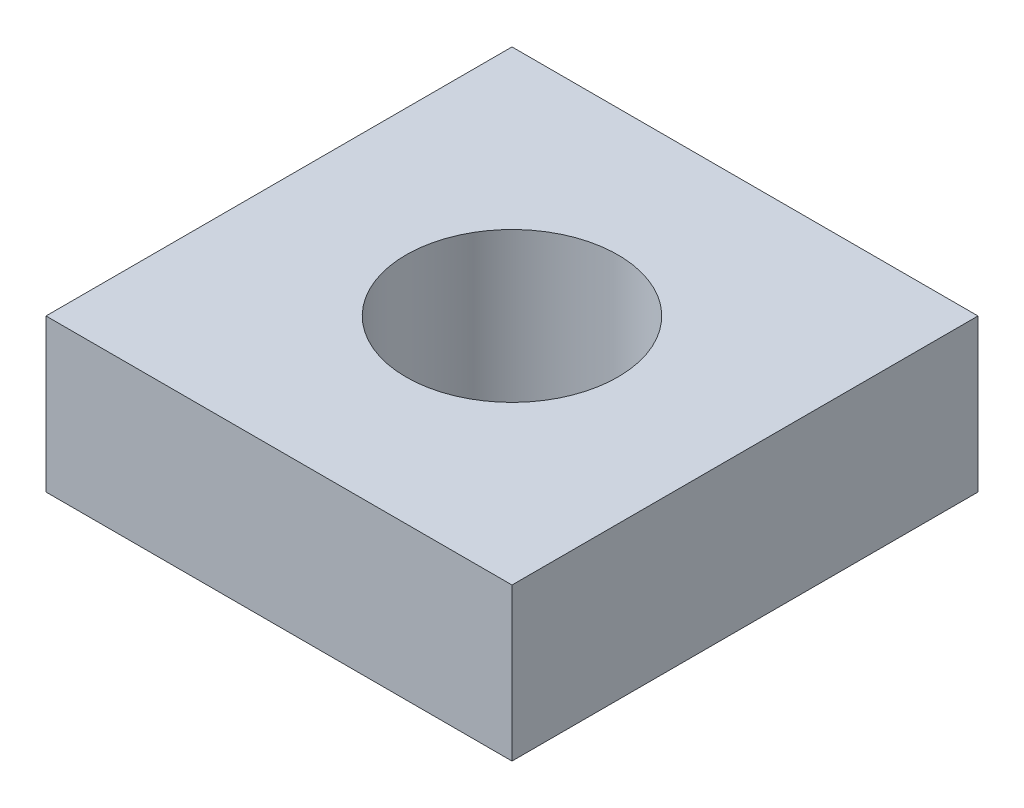
ISO-10303-21;
HEADER;
FILE_DESCRIPTION(('STEP AP214'),'2;1');
FILE_NAME('part.step','',(''),(''),'','','');
FILE_SCHEMA(('AUTOMOTIVE_DESIGN { 1 0 10303 214 1 1 1 1 }'));
ENDSEC;
DATA;
#1=APPLICATION_CONTEXT('core data for automotive mechanical design processes');
#2=APPLICATION_PROTOCOL_DEFINITION('international standard','automotive_design',2000,#1);
#3=PRODUCT_CONTEXT('',#1,'mechanical');
#4=PRODUCT('Part','Part','',(#3));
#5=PRODUCT_RELATED_PRODUCT_CATEGORY('part','',(#4));
#6=PRODUCT_DEFINITION_FORMATION('','',#4);
#7=PRODUCT_DEFINITION_CONTEXT('part definition',#1,'design');
#8=PRODUCT_DEFINITION('design','',#6,#7);
#9=PRODUCT_DEFINITION_SHAPE('','',#8);
#10=(LENGTH_UNIT() NAMED_UNIT(*) SI_UNIT(.MILLI.,.METRE.));
#11=(NAMED_UNIT(*) PLANE_ANGLE_UNIT() SI_UNIT($,.RADIAN.));
#12=(NAMED_UNIT(*) SI_UNIT($,.STERADIAN.) SOLID_ANGLE_UNIT());
#13=UNCERTAINTY_MEASURE_WITH_UNIT(LENGTH_MEASURE(1.E-05),#10,'distance_accuracy_value','');
#14=(GEOMETRIC_REPRESENTATION_CONTEXT(3) GLOBAL_UNCERTAINTY_ASSIGNED_CONTEXT((#13)) GLOBAL_UNIT_ASSIGNED_CONTEXT((#10,
#11,#12)) REPRESENTATION_CONTEXT('',''));
#15=CARTESIAN_POINT('',(0.,0.,0.));
#16=DIRECTION('',(0.,0.,1.));
#17=DIRECTION('',(1.,0.,0.));
#18=AXIS2_PLACEMENT_3D('',#15,#16,#17);
#19=CARTESIAN_POINT('',(-2.75,1.8,-2.75));
#20=DIRECTION('',(1.,0.,0.));
#21=DIRECTION('',(0.,0.,-1.));
#22=AXIS2_PLACEMENT_3D('',#19,#20,#21);
#23=PLANE('',#22);
#24=DIRECTION('',(0.,0.,1.));
#25=VECTOR('',#24,1.);
#26=CARTESIAN_POINT('',(-2.75,0.,-2.75));
#27=LINE('',#26,#25);
#28=CARTESIAN_POINT('',(-2.75,0.,-2.75));
#29=VERTEX_POINT('',#28);
#30=CARTESIAN_POINT('',(-2.75,0.,2.75));
#31=VERTEX_POINT('',#30);
#32=EDGE_CURVE('E100',#29,#31,#27,.T.);
#33=ORIENTED_EDGE('',*,*,#32,.T.);
#34=DIRECTION('',(0.,-1.,0.));
#35=VECTOR('',#34,1.);
#36=CARTESIAN_POINT('',(-2.75,1.8,2.75));
#37=LINE('',#36,#35);
#38=CARTESIAN_POINT('',(-2.75,1.8,2.75));
#39=VERTEX_POINT('',#38);
#40=EDGE_CURVE('E11',#39,#31,#37,.T.);
#41=ORIENTED_EDGE('',*,*,#40,.F.);
#42=DIRECTION('',(0.,0.,1.));
#43=VECTOR('',#42,1.);
#44=CARTESIAN_POINT('',(-2.75,1.8,-2.75));
#45=LINE('',#44,#43);
#46=CARTESIAN_POINT('',(-2.75,1.8,-2.75));
#47=VERTEX_POINT('',#46);
#48=EDGE_CURVE('E88',#47,#39,#45,.T.);
#49=ORIENTED_EDGE('',*,*,#48,.F.);
#50=DIRECTION('',(0.,-1.,0.));
#51=VECTOR('',#50,1.);
#52=CARTESIAN_POINT('',(-2.75,1.8,-2.75));
#53=LINE('',#52,#51);
#54=EDGE_CURVE('E96',#47,#29,#53,.T.);
#55=ORIENTED_EDGE('',*,*,#54,.T.);
#56=EDGE_LOOP('',(#33,#41,#49,#55));
#57=FACE_BOUND('',#56,.T.);
#58=ADVANCED_FACE('F37',(#57),#23,.F.);
#59=CARTESIAN_POINT('',(2.75,1.8,2.75));
#60=DIRECTION('',(0.,0.,-1.));
#61=DIRECTION('',(-1.,0.,0.));
#62=AXIS2_PLACEMENT_3D('',#59,#60,#61);
#63=PLANE('',#62);
#64=DIRECTION('',(1.,0.,0.));
#65=VECTOR('',#64,1.);
#66=CARTESIAN_POINT('',(2.75,0.,2.75));
#67=LINE('',#66,#65);
#68=CARTESIAN_POINT('',(2.75,0.,2.75));
#69=VERTEX_POINT('',#68);
#70=EDGE_CURVE('E92',#31,#69,#67,.T.);
#71=ORIENTED_EDGE('',*,*,#70,.T.);
#72=DIRECTION('',(0.,-1.,0.));
#73=VECTOR('',#72,1.);
#74=CARTESIAN_POINT('',(2.75,1.8,2.75));
#75=LINE('',#74,#73);
#76=CARTESIAN_POINT('',(2.75,1.8,2.75));
#77=VERTEX_POINT('',#76);
#78=EDGE_CURVE('E45',#77,#69,#75,.T.);
#79=ORIENTED_EDGE('',*,*,#78,.F.);
#80=DIRECTION('',(1.,0.,0.));
#81=VECTOR('',#80,1.);
#82=CARTESIAN_POINT('',(2.75,1.8,2.75));
#83=LINE('',#82,#81);
#84=EDGE_CURVE('E83',#39,#77,#83,.T.);
#85=ORIENTED_EDGE('',*,*,#84,.F.);
#86=ORIENTED_EDGE('',*,*,#40,.T.);
#87=EDGE_LOOP('',(#71,#79,#85,#86));
#88=FACE_BOUND('',#87,.T.);
#89=ADVANCED_FACE('F91',(#88),#63,.F.);
#90=CARTESIAN_POINT('',(2.75,1.8,-2.75));
#91=DIRECTION('',(-1.,0.,0.));
#92=DIRECTION('',(0.,0.,1.));
#93=AXIS2_PLACEMENT_3D('',#90,#91,#92);
#94=PLANE('',#93);
#95=DIRECTION('',(0.,0.,-1.));
#96=VECTOR('',#95,1.);
#97=CARTESIAN_POINT('',(2.75,0.,-2.75));
#98=LINE('',#97,#96);
#99=CARTESIAN_POINT('',(2.75,0.,-2.75));
#100=VERTEX_POINT('',#99);
#101=EDGE_CURVE('E70',#69,#100,#98,.T.);
#102=ORIENTED_EDGE('',*,*,#101,.T.);
#103=DIRECTION('',(0.,-1.,0.));
#104=VECTOR('',#103,1.);
#105=CARTESIAN_POINT('',(2.75,1.8,-2.75));
#106=LINE('',#105,#104);
#107=CARTESIAN_POINT('',(2.75,1.8,-2.75));
#108=VERTEX_POINT('',#107);
#109=EDGE_CURVE('E93',#108,#100,#106,.T.);
#110=ORIENTED_EDGE('',*,*,#109,.F.);
#111=DIRECTION('',(0.,0.,-1.));
#112=VECTOR('',#111,1.);
#113=CARTESIAN_POINT('',(2.75,1.8,-2.75));
#114=LINE('',#113,#112);
#115=EDGE_CURVE('E86',#77,#108,#114,.T.);
#116=ORIENTED_EDGE('',*,*,#115,.F.);
#117=ORIENTED_EDGE('',*,*,#78,.T.);
#118=EDGE_LOOP('',(#102,#110,#116,#117));
#119=FACE_BOUND('',#118,.T.);
#120=ADVANCED_FACE('F94',(#119),#94,.F.);
#121=CARTESIAN_POINT('',(2.75,1.8,-2.75));
#122=DIRECTION('',(0.,0.,1.));
#123=DIRECTION('',(1.,0.,0.));
#124=AXIS2_PLACEMENT_3D('',#121,#122,#123);
#125=PLANE('',#124);
#126=DIRECTION('',(-1.,0.,0.));
#127=VECTOR('',#126,1.);
#128=CARTESIAN_POINT('',(2.75,0.,-2.75));
#129=LINE('',#128,#127);
#130=EDGE_CURVE('E76',#100,#29,#129,.T.);
#131=ORIENTED_EDGE('',*,*,#130,.T.);
#132=ORIENTED_EDGE('',*,*,#54,.F.);
#133=DIRECTION('',(-1.,0.,0.));
#134=VECTOR('',#133,1.);
#135=CARTESIAN_POINT('',(2.75,1.8,-2.75));
#136=LINE('',#135,#134);
#137=EDGE_CURVE('E53',#108,#47,#136,.T.);
#138=ORIENTED_EDGE('',*,*,#137,.F.);
#139=ORIENTED_EDGE('',*,*,#109,.T.);
#140=EDGE_LOOP('',(#131,#132,#138,#139));
#141=FACE_BOUND('',#140,.T.);
#142=ADVANCED_FACE('F108',(#141),#125,.F.);
#143=CARTESIAN_POINT('',(0.,1.8,0.));
#144=DIRECTION('',(0.,-1.,0.));
#145=DIRECTION('',(0.,0.,-1.));
#146=AXIS2_PLACEMENT_3D('',#143,#144,#145);
#147=PLANE('',#146);
#148=CARTESIAN_POINT('',(0.,1.8,0.));
#149=DIRECTION('',(0.,1.,0.));
#150=DIRECTION('',(0.,0.,1.));
#151=AXIS2_PLACEMENT_3D('',#148,#149,#150);
#152=CIRCLE('',#151,1.24999999999999);
#153=CARTESIAN_POINT('',(0.,1.8,1.24999999999999));
#154=VERTEX_POINT('',#153);
#155=EDGE_CURVE('E116',#154,#154,#152,.T.);
#156=ORIENTED_EDGE('',*,*,#155,.F.);
#157=EDGE_LOOP('',(#156));
#158=FACE_BOUND('',#157,.T.);
#159=ORIENTED_EDGE('',*,*,#48,.T.);
#160=ORIENTED_EDGE('',*,*,#84,.T.);
#161=ORIENTED_EDGE('',*,*,#115,.T.);
#162=ORIENTED_EDGE('',*,*,#137,.T.);
#163=EDGE_LOOP('',(#159,#160,#161,#162));
#164=FACE_BOUND('',#163,.T.);
#165=ADVANCED_FACE('F84',(#158,#164),#147,.F.);
#166=CARTESIAN_POINT('',(0.,0.,0.));
#167=DIRECTION('',(0.,-1.,0.));
#168=DIRECTION('',(0.,0.,-1.));
#169=AXIS2_PLACEMENT_3D('',#166,#167,#168);
#170=PLANE('',#169);
#171=CARTESIAN_POINT('',(0.,0.,0.));
#172=DIRECTION('',(0.,1.,0.));
#173=DIRECTION('',(0.,0.,1.));
#174=AXIS2_PLACEMENT_3D('',#171,#172,#173);
#175=CIRCLE('',#174,1.24999999999999);
#176=CARTESIAN_POINT('',(0.,0.,1.24999999999999));
#177=VERTEX_POINT('',#176);
#178=EDGE_CURVE('E103',#177,#177,#175,.T.);
#179=ORIENTED_EDGE('',*,*,#178,.T.);
#180=EDGE_LOOP('',(#179));
#181=FACE_BOUND('',#180,.T.);
#182=ORIENTED_EDGE('',*,*,#32,.F.);
#183=ORIENTED_EDGE('',*,*,#130,.F.);
#184=ORIENTED_EDGE('',*,*,#101,.F.);
#185=ORIENTED_EDGE('',*,*,#70,.F.);
#186=EDGE_LOOP('',(#182,#183,#184,#185));
#187=FACE_BOUND('',#186,.T.);
#188=ADVANCED_FACE('F111',(#181,#187),#170,.T.);
#189=CARTESIAN_POINT('',(0.,1.8,0.));
#190=DIRECTION('',(0.,1.,0.));
#191=DIRECTION('',(0.,0.,1.));
#192=AXIS2_PLACEMENT_3D('',#189,#190,#191);
#193=CYLINDRICAL_SURFACE('',#192,1.24999999999999);
#194=ORIENTED_EDGE('',*,*,#178,.F.);
#195=EDGE_LOOP('',(#194));
#196=FACE_BOUND('',#195,.T.);
#197=ORIENTED_EDGE('',*,*,#155,.T.);
#198=EDGE_LOOP('',(#197));
#199=FACE_BOUND('',#198,.T.);
#200=ADVANCED_FACE('F120',(#196,#199),#193,.F.);
#201=CLOSED_SHELL('',(#58,#89,#120,#142,#165,#188,#200));
#202=MANIFOLD_SOLID_BREP('B2',#201);
#203=ADVANCED_BREP_SHAPE_REPRESENTATION('',(#18,#202),#14);
#204=SHAPE_DEFINITION_REPRESENTATION(#9,#203);
ENDSEC;
END-ISO-10303-21;
